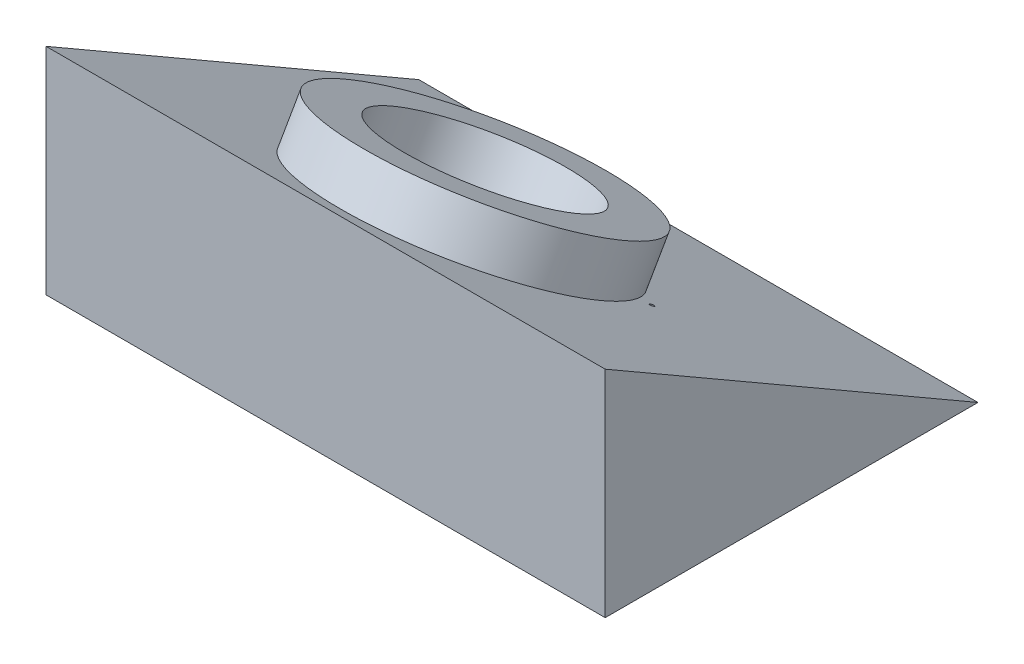
ISO-10303-21;
HEADER;
FILE_DESCRIPTION(('STEP AP214'),'2;1');
FILE_NAME('part.step','',(''),(''),'','','');
FILE_SCHEMA(('AUTOMOTIVE_DESIGN { 1 0 10303 214 1 1 1 1 }'));
ENDSEC;
DATA;
#1=APPLICATION_CONTEXT('core data for automotive mechanical design processes');
#2=APPLICATION_PROTOCOL_DEFINITION('international standard','automotive_design',2000,#1);
#3=PRODUCT_CONTEXT('',#1,'mechanical');
#4=PRODUCT('Part','Part','',(#3));
#5=PRODUCT_RELATED_PRODUCT_CATEGORY('part','',(#4));
#6=PRODUCT_DEFINITION_FORMATION('','',#4);
#7=PRODUCT_DEFINITION_CONTEXT('part definition',#1,'design');
#8=PRODUCT_DEFINITION('design','',#6,#7);
#9=PRODUCT_DEFINITION_SHAPE('','',#8);
#10=(LENGTH_UNIT() NAMED_UNIT(*) SI_UNIT(.MILLI.,.METRE.));
#11=(NAMED_UNIT(*) PLANE_ANGLE_UNIT() SI_UNIT($,.RADIAN.));
#12=(NAMED_UNIT(*) SI_UNIT($,.STERADIAN.) SOLID_ANGLE_UNIT());
#13=UNCERTAINTY_MEASURE_WITH_UNIT(LENGTH_MEASURE(1.E-05),#10,'distance_accuracy_value','');
#14=(GEOMETRIC_REPRESENTATION_CONTEXT(3) GLOBAL_UNCERTAINTY_ASSIGNED_CONTEXT((#13)) GLOBAL_UNIT_ASSIGNED_CONTEXT((#10,
#11,#12)) REPRESENTATION_CONTEXT('',''));
#15=CARTESIAN_POINT('',(0.,0.,0.));
#16=DIRECTION('',(0.,0.,1.));
#17=DIRECTION('',(1.,0.,0.));
#18=AXIS2_PLACEMENT_3D('',#15,#16,#17);
#19=CARTESIAN_POINT('',(-9.525,17.78,6.35));
#20=DIRECTION('',(1.,0.,0.));
#21=DIRECTION('',(0.,0.,-1.));
#22=AXIS2_PLACEMENT_3D('',#19,#20,#21);
#23=PLANE('',#22);
#24=DIRECTION('',(0.,-1.,0.));
#25=VECTOR('',#24,1.);
#26=CARTESIAN_POINT('',(-9.525,17.78,6.35));
#27=LINE('',#26,#25);
#28=CARTESIAN_POINT('',(-9.525,-0.287651581291733,6.35));
#29=VERTEX_POINT('',#28);
#30=CARTESIAN_POINT('',(-9.525,-7.62,6.35));
#31=VERTEX_POINT('',#30);
#32=EDGE_CURVE('E42',#29,#31,#27,.T.);
#33=ORIENTED_EDGE('',*,*,#32,.F.);
#34=DIRECTION('',(0.,-0.500000000000001,-0.866025403784438));
#35=VECTOR('',#34,1.);
#36=CARTESIAN_POINT('',(-9.525,-7.62,-6.35));
#37=LINE('',#36,#35);
#38=CARTESIAN_POINT('',(-9.525,-7.62,-6.35));
#39=VERTEX_POINT('',#38);
#40=EDGE_CURVE('E68',#29,#39,#37,.T.);
#41=ORIENTED_EDGE('',*,*,#40,.T.);
#42=DIRECTION('',(0.,0.,1.));
#43=VECTOR('',#42,1.);
#44=CARTESIAN_POINT('',(-9.525,-7.62,6.35));
#45=LINE('',#44,#43);
#46=EDGE_CURVE('E82',#39,#31,#45,.T.);
#47=ORIENTED_EDGE('',*,*,#46,.T.);
#48=EDGE_LOOP('',(#33,#41,#47));
#49=FACE_BOUND('',#48,.T.);
#50=ADVANCED_FACE('F34',(#49),#23,.F.);
#51=CARTESIAN_POINT('',(-9.525,17.78,6.35));
#52=DIRECTION('',(0.,0.,-1.));
#53=DIRECTION('',(-1.,0.,0.));
#54=AXIS2_PLACEMENT_3D('',#51,#52,#53);
#55=PLANE('',#54);
#56=DIRECTION('',(0.,-1.,0.));
#57=VECTOR('',#56,1.);
#58=CARTESIAN_POINT('',(9.525,17.78,6.35));
#59=LINE('',#58,#57);
#60=CARTESIAN_POINT('',(9.525,-0.287651581291733,6.35));
#61=VERTEX_POINT('',#60);
#62=CARTESIAN_POINT('',(9.525,-7.62,6.35));
#63=VERTEX_POINT('',#62);
#64=EDGE_CURVE('E56',#61,#63,#59,.T.);
#65=ORIENTED_EDGE('',*,*,#64,.F.);
#66=DIRECTION('',(1.,0.,0.));
#67=VECTOR('',#66,1.);
#68=CARTESIAN_POINT('',(-9.525,-0.287651581291733,6.35));
#69=LINE('',#68,#67);
#70=EDGE_CURVE('E71',#29,#61,#69,.T.);
#71=ORIENTED_EDGE('',*,*,#70,.F.);
#72=ORIENTED_EDGE('',*,*,#32,.T.);
#73=DIRECTION('',(1.,0.,0.));
#74=VECTOR('',#73,1.);
#75=CARTESIAN_POINT('',(-9.525,-7.62,6.35));
#76=LINE('',#75,#74);
#77=EDGE_CURVE('E112',#31,#63,#76,.T.);
#78=ORIENTED_EDGE('',*,*,#77,.T.);
#79=EDGE_LOOP('',(#65,#71,#72,#78));
#80=FACE_BOUND('',#79,.T.);
#81=ADVANCED_FACE('F80',(#80),#55,.F.);
#82=CARTESIAN_POINT('',(9.525,17.78,6.35));
#83=DIRECTION('',(-1.,0.,0.));
#84=DIRECTION('',(0.,0.,1.));
#85=AXIS2_PLACEMENT_3D('',#82,#83,#84);
#86=PLANE('',#85);
#87=DIRECTION('',(0.,0.,-1.));
#88=VECTOR('',#87,1.);
#89=CARTESIAN_POINT('',(9.525,-7.62,6.35));
#90=LINE('',#89,#88);
#91=CARTESIAN_POINT('',(9.525,-7.62,-6.35));
#92=VERTEX_POINT('',#91);
#93=EDGE_CURVE('E114',#63,#92,#90,.T.);
#94=ORIENTED_EDGE('',*,*,#93,.T.);
#95=DIRECTION('',(0.,-0.500000000000001,-0.866025403784438));
#96=VECTOR('',#95,1.);
#97=CARTESIAN_POINT('',(9.525,-7.62,-6.35));
#98=LINE('',#97,#96);
#99=EDGE_CURVE('E50',#61,#92,#98,.T.);
#100=ORIENTED_EDGE('',*,*,#99,.F.);
#101=ORIENTED_EDGE('',*,*,#64,.T.);
#102=EDGE_LOOP('',(#94,#100,#101));
#103=FACE_BOUND('',#102,.T.);
#104=ADVANCED_FACE('F116',(#103),#86,.F.);
#105=CARTESIAN_POINT('',(0.,-7.62,0.));
#106=DIRECTION('',(0.,-1.,0.));
#107=DIRECTION('',(0.,0.,-1.));
#108=AXIS2_PLACEMENT_3D('',#105,#106,#107);
#109=PLANE('',#108);
#110=CARTESIAN_POINT('',(-4.7625,-7.62,0.));
#111=DIRECTION('',(0.,-1.,0.));
#112=DIRECTION('',(0.,0.,-1.));
#113=AXIS2_PLACEMENT_3D('',#110,#111,#112);
#114=CIRCLE('',#113,1.5113);
#115=CARTESIAN_POINT('',(-4.7625,-7.62,-1.5113));
#116=VERTEX_POINT('',#115);
#117=EDGE_CURVE('E238',#116,#116,#114,.T.);
#118=ORIENTED_EDGE('',*,*,#117,.F.);
#119=EDGE_LOOP('',(#118));
#120=FACE_BOUND('',#119,.T.);
#121=CARTESIAN_POINT('',(4.7625,-7.62,0.));
#122=DIRECTION('',(0.,-1.,0.));
#123=DIRECTION('',(0.,0.,-1.));
#124=AXIS2_PLACEMENT_3D('',#121,#122,#123);
#125=CIRCLE('',#124,1.5113);
#126=CARTESIAN_POINT('',(4.7625,-7.62,-1.5113));
#127=VERTEX_POINT('',#126);
#128=EDGE_CURVE('E97',#127,#127,#125,.T.);
#129=ORIENTED_EDGE('',*,*,#128,.F.);
#130=EDGE_LOOP('',(#129));
#131=FACE_BOUND('',#130,.T.);
#132=ORIENTED_EDGE('',*,*,#46,.F.);
#133=DIRECTION('',(-1.,0.,0.));
#134=VECTOR('',#133,1.);
#135=CARTESIAN_POINT('',(-9.525,-7.62,-6.35));
#136=LINE('',#135,#134);
#137=EDGE_CURVE('E73',#92,#39,#136,.T.);
#138=ORIENTED_EDGE('',*,*,#137,.F.);
#139=ORIENTED_EDGE('',*,*,#93,.F.);
#140=ORIENTED_EDGE('',*,*,#77,.F.);
#141=EDGE_LOOP('',(#132,#138,#139,#140));
#142=FACE_BOUND('',#141,.T.);
#143=ADVANCED_FACE('F118',(#120,#131,#142),#109,.T.);
#144=CARTESIAN_POINT('',(-9.525,-7.62,-6.35));
#145=DIRECTION('',(0.,-0.866025403784438,0.500000000000001));
#146=DIRECTION('',(0.,-0.500000000000001,-0.866025403784438));
#147=AXIS2_PLACEMENT_3D('',#144,#145,#146);
#148=PLANE('',#147);
#149=CARTESIAN_POINT('',(-4.7625,-3.95382579064587,0.));
#150=DIRECTION('',(0.,-0.866025403784438,0.500000000000001));
#151=DIRECTION('',(0.,-0.500000000000001,-0.866025403784438));
#152=AXIS2_PLACEMENT_3D('',#149,#150,#151);
#153=ELLIPSE('',#152,0.0865217113407558,0.0749299999999987);
#154=CARTESIAN_POINT('',(-4.7625,-3.99708664631624,-0.0749299999999987));
#155=VERTEX_POINT('',#154);
#156=EDGE_CURVE('E37',#155,#155,#153,.T.);
#157=ORIENTED_EDGE('',*,*,#156,.T.);
#158=EDGE_LOOP('',(#157));
#159=FACE_BOUND('',#158,.T.);
#160=CARTESIAN_POINT('',(4.7625,-3.95382579064587,0.));
#161=DIRECTION('',(0.,-0.866025403784438,0.500000000000001));
#162=DIRECTION('',(0.,-0.500000000000001,-0.866025403784438));
#163=AXIS2_PLACEMENT_3D('',#160,#161,#162);
#164=ELLIPSE('',#163,0.0865217113407558,0.0749299999999987);
#165=CARTESIAN_POINT('',(4.7625,-3.99708664631624,-0.0749299999999987));
#166=VERTEX_POINT('',#165);
#167=EDGE_CURVE('E87',#166,#166,#164,.T.);
#168=ORIENTED_EDGE('',*,*,#167,.T.);
#169=EDGE_LOOP('',(#168));
#170=FACE_BOUND('',#169,.T.);
#171=CARTESIAN_POINT('',(0.,-2.9653693429844,1.71205678841871));
#172=DIRECTION('',(0.,0.866025403784438,-0.500000000000001));
#173=DIRECTION('',(0.,0.500000000000001,0.866025403784438));
#174=AXIS2_PLACEMENT_3D('',#171,#172,#173);
#175=CIRCLE('',#174,4.7625);
#176=CARTESIAN_POINT('',(0.,-0.584119342984391,5.83650277394209));
#177=VERTEX_POINT('',#176);
#178=EDGE_CURVE('E11',#177,#177,#175,.T.);
#179=ORIENTED_EDGE('',*,*,#178,.F.);
#180=EDGE_LOOP('',(#179));
#181=FACE_BOUND('',#180,.T.);
#182=ORIENTED_EDGE('',*,*,#99,.T.);
#183=ORIENTED_EDGE('',*,*,#137,.T.);
#184=ORIENTED_EDGE('',*,*,#40,.F.);
#185=ORIENTED_EDGE('',*,*,#70,.T.);
#186=EDGE_LOOP('',(#182,#183,#184,#185));
#187=FACE_BOUND('',#186,.T.);
#188=ADVANCED_FACE('F70',(#159,#170,#181,#187),#148,.F.);
#189=CARTESIAN_POINT('',(0.,-1.5905540144766,0.918306788418707));
#190=DIRECTION('',(0.,0.866025403784438,-0.500000000000001));
#191=DIRECTION('',(0.,0.500000000000001,0.866025403784438));
#192=AXIS2_PLACEMENT_3D('',#189,#190,#191);
#193=PLANE('',#192);
#194=CARTESIAN_POINT('',(0.,-1.5905540144766,0.918306788418707));
#195=DIRECTION('',(0.,0.866025403784438,-0.500000000000001));
#196=DIRECTION('',(0.,0.500000000000001,0.866025403784438));
#197=AXIS2_PLACEMENT_3D('',#194,#195,#196);
#198=CIRCLE('',#197,4.7625);
#199=CARTESIAN_POINT('',(0.,0.790695985523404,5.04275277394209));
#200=VERTEX_POINT('',#199);
#201=EDGE_CURVE('E106',#200,#200,#198,.T.);
#202=ORIENTED_EDGE('',*,*,#201,.T.);
#203=EDGE_LOOP('',(#202));
#204=FACE_BOUND('',#203,.T.);
#205=CARTESIAN_POINT('',(0.,-1.5905540144766,0.918306788418707));
#206=DIRECTION('',(0.,0.866025403784438,-0.500000000000001));
#207=DIRECTION('',(0.,0.500000000000001,0.866025403784438));
#208=AXIS2_PLACEMENT_3D('',#205,#206,#207);
#209=CIRCLE('',#208,3.175);
#210=CARTESIAN_POINT('',(0.,-0.00305401447659739,3.6679374454343));
#211=VERTEX_POINT('',#210);
#212=EDGE_CURVE('E94',#211,#211,#209,.T.);
#213=ORIENTED_EDGE('',*,*,#212,.F.);
#214=EDGE_LOOP('',(#213));
#215=FACE_BOUND('',#214,.T.);
#216=ADVANCED_FACE('F126',(#204,#215),#193,.T.);
#217=CARTESIAN_POINT('',(0.,-1.5905540144766,0.918306788418707));
#218=DIRECTION('',(0.,-0.866025403784438,0.500000000000001));
#219=DIRECTION('',(0.,-0.500000000000001,-0.866025403784438));
#220=AXIS2_PLACEMENT_3D('',#217,#218,#219);
#221=CYLINDRICAL_SURFACE('',#220,4.7625);
#222=ORIENTED_EDGE('',*,*,#201,.F.);
#223=EDGE_LOOP('',(#222));
#224=FACE_BOUND('',#223,.T.);
#225=ORIENTED_EDGE('',*,*,#178,.T.);
#226=EDGE_LOOP('',(#225));
#227=FACE_BOUND('',#226,.T.);
#228=ADVANCED_FACE('F153',(#224,#227),#221,.T.);
#229=CARTESIAN_POINT('',(0.,-1.5905540144766,0.918306788418707));
#230=DIRECTION('',(0.,-0.866025403784438,0.500000000000001));
#231=DIRECTION('',(0.,-0.500000000000001,-0.866025403784438));
#232=AXIS2_PLACEMENT_3D('',#229,#230,#231);
#233=CYLINDRICAL_SURFACE('',#232,3.175);
#234=ORIENTED_EDGE('',*,*,#212,.T.);
#235=EDGE_LOOP('',(#234));
#236=FACE_BOUND('',#235,.T.);
#237=CARTESIAN_POINT('',(0.,-2.9653693429844,1.71205678841871));
#238=DIRECTION('',(0.,0.866025403784438,-0.500000000000001));
#239=DIRECTION('',(0.,0.500000000000001,0.866025403784438));
#240=AXIS2_PLACEMENT_3D('',#237,#238,#239);
#241=CIRCLE('',#240,3.175);
#242=CARTESIAN_POINT('',(0.,-1.37786934298439,4.4616874454343));
#243=VERTEX_POINT('',#242);
#244=EDGE_CURVE('E89',#243,#243,#241,.T.);
#245=ORIENTED_EDGE('',*,*,#244,.F.);
#246=EDGE_LOOP('',(#245));
#247=FACE_BOUND('',#246,.T.);
#248=ADVANCED_FACE('F164',(#236,#247),#233,.F.);
#249=ORIENTED_EDGE('',*,*,#244,.T.);
#250=EDGE_LOOP('',(#249));
#251=FACE_BOUND('',#250,.T.);
#252=ADVANCED_FACE('F129',(#251),#148,.F.);
#253=CARTESIAN_POINT('',(4.7625,-7.62,0.));
#254=DIRECTION('',(0.,-1.,0.));
#255=DIRECTION('',(0.,0.,-1.));
#256=AXIS2_PLACEMENT_3D('',#253,#254,#255);
#257=CYLINDRICAL_SURFACE('',#256,0.0749299999999987);
#258=CARTESIAN_POINT('',(4.7625,-6.41474246276589,0.));
#259=DIRECTION('',(0.,-1.,0.));
#260=DIRECTION('',(0.,0.,-1.));
#261=AXIS2_PLACEMENT_3D('',#258,#259,#260);
#262=CIRCLE('',#261,0.0749299999999991);
#263=CARTESIAN_POINT('',(4.7625,-6.41474246276589,-0.0749299999999987));
#264=VERTEX_POINT('',#263);
#265=EDGE_CURVE('E90',#264,#264,#262,.T.);
#266=ORIENTED_EDGE('',*,*,#265,.T.);
#267=EDGE_LOOP('',(#266));
#268=FACE_BOUND('',#267,.T.);
#269=ORIENTED_EDGE('',*,*,#167,.F.);
#270=EDGE_LOOP('',(#269));
#271=FACE_BOUND('',#270,.T.);
#272=ADVANCED_FACE('F182',(#268,#271),#257,.F.);
#273=CARTESIAN_POINT('',(4.7625,-7.62,0.));
#274=DIRECTION('',(0.,-1.,0.));
#275=DIRECTION('',(0.,0.,-1.));
#276=AXIS2_PLACEMENT_3D('',#273,#274,#275);
#277=CONICAL_SURFACE('',#276,1.5113,0.872664625997165);
#278=CARTESIAN_POINT('',(4.7625,-6.41474246276589,-0.0749299999999987));
#279=CARTESIAN_POINT('',(4.7625,-6.42729722877875,-0.0898921874999988));
#280=CARTESIAN_POINT('',(4.7625,-6.4398519947916,-0.104854374999999));
#281=CARTESIAN_POINT('',(4.7625,-6.46496152681731,-0.134778749999999));
#282=CARTESIAN_POINT('',(4.7625,-6.47751629283017,-0.149740937499999));
#283=CARTESIAN_POINT('',(4.7625,-6.50262582485588,-0.179665312499999));
#284=CARTESIAN_POINT('',(4.7625,-6.51518059086873,-0.194627499999999));
#285=CARTESIAN_POINT('',(4.7625,-6.54029012289444,-0.224551874999999));
#286=CARTESIAN_POINT('',(4.7625,-6.5528448889073,-0.239514062499999));
#287=CARTESIAN_POINT('',(4.7625,-6.57795442093301,-0.269438437499999));
#288=CARTESIAN_POINT('',(4.7625,-6.59050918694586,-0.284400624999999));
#289=CARTESIAN_POINT('',(4.7625,-6.61561871897158,-0.314324999999999));
#290=CARTESIAN_POINT('',(4.7625,-6.62817348498443,-0.329287187499999));
#291=CARTESIAN_POINT('',(4.7625,-6.65328301701014,-0.359211562499999));
#292=CARTESIAN_POINT('',(4.7625,-6.665837783023,-0.374173749999999));
#293=CARTESIAN_POINT('',(4.7625,-6.69094731504871,-0.404098124999999));
#294=CARTESIAN_POINT('',(4.7625,-6.70350208106156,-0.419060312499999));
#295=CARTESIAN_POINT('',(4.7625,-6.72861161308727,-0.448984687499999));
#296=CARTESIAN_POINT('',(4.7625,-6.74116637910013,-0.463946874999999));
#297=CARTESIAN_POINT('',(4.7625,-6.76627591112584,-0.493871249999999));
#298=CARTESIAN_POINT('',(4.7625,-6.77883067713869,-0.508833437499999));
#299=CARTESIAN_POINT('',(4.7625,-6.8039402091644,-0.538757812499999));
#300=CARTESIAN_POINT('',(4.7625,-6.81649497517726,-0.553719999999999));
#301=CARTESIAN_POINT('',(4.7625,-6.84160450720297,-0.583644374999999));
#302=CARTESIAN_POINT('',(4.7625,-6.85415927321583,-0.598606562499999));
#303=CARTESIAN_POINT('',(4.7625,-6.87926880524154,-0.628530937499999));
#304=CARTESIAN_POINT('',(4.7625,-6.89182357125439,-0.643493124999999));
#305=CARTESIAN_POINT('',(4.7625,-6.9169331032801,-0.673417499999999));
#306=CARTESIAN_POINT('',(4.7625,-6.92948786929296,-0.688379687499999));
#307=CARTESIAN_POINT('',(4.7625,-6.95459740131867,-0.718304062499999));
#308=CARTESIAN_POINT('',(4.7625,-6.96715216733152,-0.733266249999999));
#309=CARTESIAN_POINT('',(4.7625,-6.99226169935724,-0.763190624999999));
#310=CARTESIAN_POINT('',(4.7625,-7.00481646537009,-0.778152812499999));
#311=CARTESIAN_POINT('',(4.7625,-7.0299259973958,-0.808077187499999));
#312=CARTESIAN_POINT('',(4.7625,-7.04248076340866,-0.823039374999999));
#313=CARTESIAN_POINT('',(4.7625,-7.06759029543437,-0.852963749999999));
#314=CARTESIAN_POINT('',(4.7625,-7.08014506144722,-0.867925937499999));
#315=CARTESIAN_POINT('',(4.7625,-7.10525459347293,-0.897850312499999));
#316=CARTESIAN_POINT('',(4.7625,-7.11780935948579,-0.912812499999999));
#317=CARTESIAN_POINT('',(4.7625,-7.1429188915115,-0.942736874999999));
#318=CARTESIAN_POINT('',(4.7625,-7.15547365752435,-0.957699062499999));
#319=CARTESIAN_POINT('',(4.7625,-7.18058318955006,-0.987623437499999));
#320=CARTESIAN_POINT('',(4.7625,-7.19313795556292,-1.002585625));
#321=CARTESIAN_POINT('',(4.7625,-7.21824748758863,-1.03251));
#322=CARTESIAN_POINT('',(4.7625,-7.23080225360149,-1.0474721875));
#323=CARTESIAN_POINT('',(4.7625,-7.2559117856272,-1.0773965625));
#324=CARTESIAN_POINT('',(4.7625,-7.26846655164005,-1.09235875));
#325=CARTESIAN_POINT('',(4.7625,-7.29357608366576,-1.122283125));
#326=CARTESIAN_POINT('',(4.7625,-7.30613084967862,-1.1372453125));
#327=CARTESIAN_POINT('',(4.7625,-7.33124038170433,-1.1671696875));
#328=CARTESIAN_POINT('',(4.7625,-7.34379514771718,-1.182131875));
#329=CARTESIAN_POINT('',(4.7625,-7.36890467974289,-1.21205625));
#330=CARTESIAN_POINT('',(4.7625,-7.38145944575575,-1.2270184375));
#331=CARTESIAN_POINT('',(4.7625,-7.40656897778146,-1.2569428125));
#332=CARTESIAN_POINT('',(4.7625,-7.41912374379432,-1.271905));
#333=CARTESIAN_POINT('',(4.7625,-7.44423327582003,-1.301829375));
#334=CARTESIAN_POINT('',(4.7625,-7.45678804183288,-1.3167915625));
#335=CARTESIAN_POINT('',(4.7625,-7.48189757385859,-1.3467159375));
#336=CARTESIAN_POINT('',(4.7625,-7.49445233987145,-1.361678125));
#337=CARTESIAN_POINT('',(4.7625,-7.51956187189716,-1.3916025));
#338=CARTESIAN_POINT('',(4.7625,-7.53211663791001,-1.4065646875));
#339=CARTESIAN_POINT('',(4.7625,-7.55722616993572,-1.4364890625));
#340=CARTESIAN_POINT('',(4.7625,-7.56978093594858,-1.45145125));
#341=CARTESIAN_POINT('',(4.7625,-7.59489046797429,-1.481375625));
#342=CARTESIAN_POINT('',(4.7625,-7.60744523398714,-1.4963378125));
#343=CARTESIAN_POINT('',(4.7625,-7.62,-1.5113));
#344=B_SPLINE_CURVE_WITH_KNOTS('',3,(#278,#279,#280,#281,#282,#283,#284,#285,#286,#287,#288,
#289,#290,#291,#292,#293,#294,#295,#296,#297,#298,#299,#300,#301,#302,#303,#304,#305,#306,#307,
#308,#309,#310,#311,#312,#313,#314,#315,#316,#317,#318,#319,#320,#321,#322,#323,#324,#325,#326,
#327,#328,#329,#330,#331,#332,#333,#334,#335,#336,#337,#338,#339,#340,#341,#342,#343),
.UNSPECIFIED.,.F.,.F.,(4,2,2,2,2,2,2,2,2,2,2,2,2,2,2,2,2,2,2,2,2,2,2,2,2,2,2,2,2,2,2,2,4),(0.,
0.058595245880569,0.117190491761138,0.175785737641707,0.234380983522275,0.292976229402844,
0.351571475283413,0.410166721163983,0.468761967044551,0.52735721292512,0.585952458805689,
0.644547704686258,0.703142950566827,0.761738196447396,0.820333442327965,0.878928688208534,
0.937523934089103,0.996119179969671,1.05471442585024,1.11330967173081,1.17190491761138,
1.23050016349195,1.28909540937252,1.34769065525308,1.40628590113365,1.46488114701422,
1.52347639289479,1.58207163877536,1.64066688465593,1.6992621305365,1.75785737641707,
1.81645262229764,1.87504786817821),.UNSPECIFIED.);
#345=EDGE_CURVE('BSEAM200',#264,#127,#344,.T.);
#346=ORIENTED_EDGE('',*,*,#265,.F.);
#347=ORIENTED_EDGE('',*,*,#128,.T.);
#348=ORIENTED_EDGE('',*,*,#345,.T.);
#349=ORIENTED_EDGE('',*,*,#345,.F.);
#350=EDGE_LOOP('',(#346,#348,#347,#349));
#351=FACE_BOUND('',#350,.T.);
#352=ADVANCED_FACE('F200',(#351),#277,.F.);
#353=CARTESIAN_POINT('',(-4.7625,-7.62,0.));
#354=DIRECTION('',(0.,-1.,0.));
#355=DIRECTION('',(0.,0.,-1.));
#356=AXIS2_PLACEMENT_3D('',#353,#354,#355);
#357=CYLINDRICAL_SURFACE('',#356,0.0749299999999987);
#358=CARTESIAN_POINT('',(-4.7625,-6.41474246276589,0.));
#359=DIRECTION('',(0.,-1.,0.));
#360=DIRECTION('',(0.,0.,-1.));
#361=AXIS2_PLACEMENT_3D('',#358,#359,#360);
#362=CIRCLE('',#361,0.0749299999999991);
#363=CARTESIAN_POINT('',(-4.7625,-6.41474246276589,-0.0749299999999987));
#364=VERTEX_POINT('',#363);
#365=EDGE_CURVE('E236',#364,#364,#362,.T.);
#366=ORIENTED_EDGE('',*,*,#365,.T.);
#367=EDGE_LOOP('',(#366));
#368=FACE_BOUND('',#367,.T.);
#369=ORIENTED_EDGE('',*,*,#156,.F.);
#370=EDGE_LOOP('',(#369));
#371=FACE_BOUND('',#370,.T.);
#372=ADVANCED_FACE('F209',(#368,#371),#357,.F.);
#373=CARTESIAN_POINT('',(-4.7625,-7.62,0.));
#374=DIRECTION('',(0.,-1.,0.));
#375=DIRECTION('',(0.,0.,-1.));
#376=AXIS2_PLACEMENT_3D('',#373,#374,#375);
#377=CONICAL_SURFACE('',#376,1.5113,0.872664625997165);
#378=CARTESIAN_POINT('',(-4.7625,-6.41474246276589,-0.0749299999999987));
#379=CARTESIAN_POINT('',(-4.7625,-6.42729722877875,-0.0898921874999988));
#380=CARTESIAN_POINT('',(-4.7625,-6.4398519947916,-0.104854374999999));
#381=CARTESIAN_POINT('',(-4.7625,-6.46496152681731,-0.134778749999999));
#382=CARTESIAN_POINT('',(-4.7625,-6.47751629283017,-0.149740937499999));
#383=CARTESIAN_POINT('',(-4.7625,-6.50262582485588,-0.179665312499999));
#384=CARTESIAN_POINT('',(-4.7625,-6.51518059086873,-0.194627499999999));
#385=CARTESIAN_POINT('',(-4.7625,-6.54029012289444,-0.224551874999999));
#386=CARTESIAN_POINT('',(-4.7625,-6.5528448889073,-0.239514062499999));
#387=CARTESIAN_POINT('',(-4.7625,-6.57795442093301,-0.269438437499999));
#388=CARTESIAN_POINT('',(-4.7625,-6.59050918694586,-0.284400624999999));
#389=CARTESIAN_POINT('',(-4.7625,-6.61561871897158,-0.314324999999999));
#390=CARTESIAN_POINT('',(-4.7625,-6.62817348498443,-0.329287187499999));
#391=CARTESIAN_POINT('',(-4.7625,-6.65328301701014,-0.359211562499999));
#392=CARTESIAN_POINT('',(-4.7625,-6.665837783023,-0.374173749999999));
#393=CARTESIAN_POINT('',(-4.7625,-6.69094731504871,-0.404098124999999));
#394=CARTESIAN_POINT('',(-4.7625,-6.70350208106156,-0.419060312499999));
#395=CARTESIAN_POINT('',(-4.7625,-6.72861161308727,-0.448984687499999));
#396=CARTESIAN_POINT('',(-4.7625,-6.74116637910013,-0.463946874999999));
#397=CARTESIAN_POINT('',(-4.7625,-6.76627591112584,-0.493871249999999));
#398=CARTESIAN_POINT('',(-4.7625,-6.77883067713869,-0.508833437499999));
#399=CARTESIAN_POINT('',(-4.7625,-6.8039402091644,-0.538757812499999));
#400=CARTESIAN_POINT('',(-4.7625,-6.81649497517726,-0.553719999999999));
#401=CARTESIAN_POINT('',(-4.7625,-6.84160450720297,-0.583644374999999));
#402=CARTESIAN_POINT('',(-4.7625,-6.85415927321583,-0.598606562499999));
#403=CARTESIAN_POINT('',(-4.7625,-6.87926880524154,-0.628530937499999));
#404=CARTESIAN_POINT('',(-4.7625,-6.89182357125439,-0.643493124999999));
#405=CARTESIAN_POINT('',(-4.7625,-6.9169331032801,-0.673417499999999));
#406=CARTESIAN_POINT('',(-4.7625,-6.92948786929296,-0.688379687499999));
#407=CARTESIAN_POINT('',(-4.7625,-6.95459740131867,-0.718304062499999));
#408=CARTESIAN_POINT('',(-4.7625,-6.96715216733152,-0.733266249999999));
#409=CARTESIAN_POINT('',(-4.7625,-6.99226169935724,-0.763190624999999));
#410=CARTESIAN_POINT('',(-4.7625,-7.00481646537009,-0.778152812499999));
#411=CARTESIAN_POINT('',(-4.7625,-7.0299259973958,-0.808077187499999));
#412=CARTESIAN_POINT('',(-4.7625,-7.04248076340866,-0.823039374999999));
#413=CARTESIAN_POINT('',(-4.7625,-7.06759029543437,-0.852963749999999));
#414=CARTESIAN_POINT('',(-4.7625,-7.08014506144722,-0.867925937499999));
#415=CARTESIAN_POINT('',(-4.7625,-7.10525459347293,-0.897850312499999));
#416=CARTESIAN_POINT('',(-4.7625,-7.11780935948579,-0.912812499999999));
#417=CARTESIAN_POINT('',(-4.7625,-7.1429188915115,-0.942736874999999));
#418=CARTESIAN_POINT('',(-4.7625,-7.15547365752435,-0.957699062499999));
#419=CARTESIAN_POINT('',(-4.7625,-7.18058318955006,-0.987623437499999));
#420=CARTESIAN_POINT('',(-4.7625,-7.19313795556292,-1.002585625));
#421=CARTESIAN_POINT('',(-4.7625,-7.21824748758863,-1.03251));
#422=CARTESIAN_POINT('',(-4.7625,-7.23080225360149,-1.0474721875));
#423=CARTESIAN_POINT('',(-4.7625,-7.2559117856272,-1.0773965625));
#424=CARTESIAN_POINT('',(-4.7625,-7.26846655164005,-1.09235875));
#425=CARTESIAN_POINT('',(-4.7625,-7.29357608366576,-1.122283125));
#426=CARTESIAN_POINT('',(-4.7625,-7.30613084967862,-1.1372453125));
#427=CARTESIAN_POINT('',(-4.7625,-7.33124038170433,-1.1671696875));
#428=CARTESIAN_POINT('',(-4.7625,-7.34379514771718,-1.182131875));
#429=CARTESIAN_POINT('',(-4.7625,-7.36890467974289,-1.21205625));
#430=CARTESIAN_POINT('',(-4.7625,-7.38145944575575,-1.2270184375));
#431=CARTESIAN_POINT('',(-4.7625,-7.40656897778146,-1.2569428125));
#432=CARTESIAN_POINT('',(-4.7625,-7.41912374379432,-1.271905));
#433=CARTESIAN_POINT('',(-4.7625,-7.44423327582003,-1.301829375));
#434=CARTESIAN_POINT('',(-4.7625,-7.45678804183288,-1.3167915625));
#435=CARTESIAN_POINT('',(-4.7625,-7.48189757385859,-1.3467159375));
#436=CARTESIAN_POINT('',(-4.7625,-7.49445233987145,-1.361678125));
#437=CARTESIAN_POINT('',(-4.7625,-7.51956187189716,-1.3916025));
#438=CARTESIAN_POINT('',(-4.7625,-7.53211663791001,-1.4065646875));
#439=CARTESIAN_POINT('',(-4.7625,-7.55722616993572,-1.4364890625));
#440=CARTESIAN_POINT('',(-4.7625,-7.56978093594858,-1.45145125));
#441=CARTESIAN_POINT('',(-4.7625,-7.59489046797429,-1.481375625));
#442=CARTESIAN_POINT('',(-4.7625,-7.60744523398714,-1.4963378125));
#443=CARTESIAN_POINT('',(-4.7625,-7.62,-1.5113));
#444=B_SPLINE_CURVE_WITH_KNOTS('',3,(#378,#379,#380,#381,#382,#383,#384,#385,#386,#387,#388,
#389,#390,#391,#392,#393,#394,#395,#396,#397,#398,#399,#400,#401,#402,#403,#404,#405,#406,#407,
#408,#409,#410,#411,#412,#413,#414,#415,#416,#417,#418,#419,#420,#421,#422,#423,#424,#425,#426,
#427,#428,#429,#430,#431,#432,#433,#434,#435,#436,#437,#438,#439,#440,#441,#442,#443),
.UNSPECIFIED.,.F.,.F.,(4,2,2,2,2,2,2,2,2,2,2,2,2,2,2,2,2,2,2,2,2,2,2,2,2,2,2,2,2,2,2,2,4),(0.,
0.058595245880569,0.117190491761138,0.175785737641707,0.234380983522275,0.292976229402844,
0.351571475283413,0.410166721163983,0.468761967044551,0.52735721292512,0.585952458805689,
0.644547704686258,0.703142950566827,0.761738196447396,0.820333442327965,0.878928688208534,
0.937523934089103,0.996119179969671,1.05471442585024,1.11330967173081,1.17190491761138,
1.23050016349195,1.28909540937252,1.34769065525308,1.40628590113365,1.46488114701422,
1.52347639289479,1.58207163877536,1.64066688465593,1.6992621305365,1.75785737641707,
1.81645262229764,1.87504786817821),.UNSPECIFIED.);
#445=EDGE_CURVE('BSEAM219',#364,#116,#444,.T.);
#446=ORIENTED_EDGE('',*,*,#365,.F.);
#447=ORIENTED_EDGE('',*,*,#117,.T.);
#448=ORIENTED_EDGE('',*,*,#445,.T.);
#449=ORIENTED_EDGE('',*,*,#445,.F.);
#450=EDGE_LOOP('',(#446,#448,#447,#449));
#451=FACE_BOUND('',#450,.T.);
#452=ADVANCED_FACE('F219',(#451),#377,.F.);
#453=CLOSED_SHELL('',(#50,#81,#104,#143,#188,#216,#228,#248,#252,#272,#352,#372,#452));
#454=MANIFOLD_SOLID_BREP('B2',#453);
#455=ADVANCED_BREP_SHAPE_REPRESENTATION('',(#18,#454),#14);
#456=SHAPE_DEFINITION_REPRESENTATION(#9,#455);
ENDSEC;
END-ISO-10303-21;
